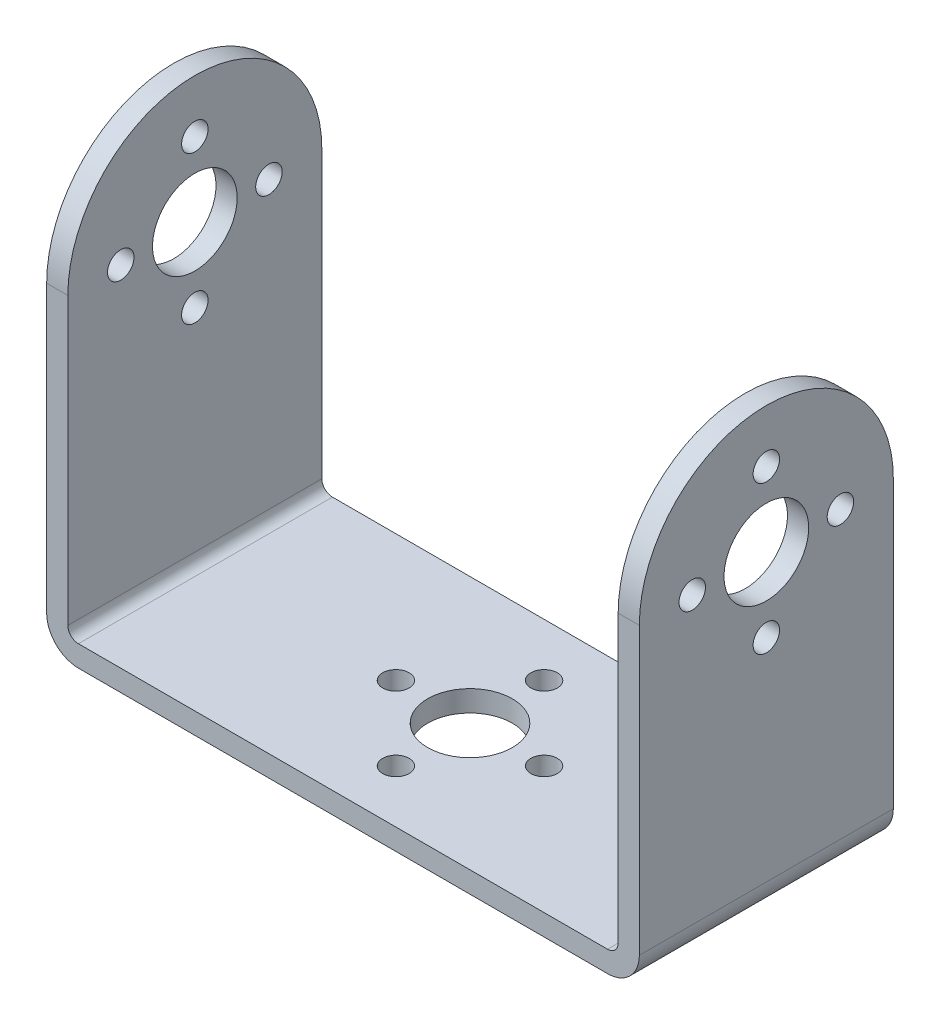
ISO-10303-21;
HEADER;
FILE_DESCRIPTION(('STEP AP214'),'2;1');
FILE_NAME('part.step','',(''),(''),'','','');
FILE_SCHEMA(('AUTOMOTIVE_DESIGN { 1 0 10303 214 1 1 1 1 }'));
ENDSEC;
DATA;
#1=APPLICATION_CONTEXT('core data for automotive mechanical design processes');
#2=APPLICATION_PROTOCOL_DEFINITION('international standard','automotive_design',2000,#1);
#3=PRODUCT_CONTEXT('',#1,'mechanical');
#4=PRODUCT('Part','Part','',(#3));
#5=PRODUCT_RELATED_PRODUCT_CATEGORY('part','',(#4));
#6=PRODUCT_DEFINITION_FORMATION('','',#4);
#7=PRODUCT_DEFINITION_CONTEXT('part definition',#1,'design');
#8=PRODUCT_DEFINITION('design','',#6,#7);
#9=PRODUCT_DEFINITION_SHAPE('','',#8);
#10=(LENGTH_UNIT() NAMED_UNIT(*) SI_UNIT(.MILLI.,.METRE.));
#11=(NAMED_UNIT(*) PLANE_ANGLE_UNIT() SI_UNIT($,.RADIAN.));
#12=(NAMED_UNIT(*) SI_UNIT($,.STERADIAN.) SOLID_ANGLE_UNIT());
#13=UNCERTAINTY_MEASURE_WITH_UNIT(LENGTH_MEASURE(1.E-05),#10,'distance_accuracy_value','');
#14=(GEOMETRIC_REPRESENTATION_CONTEXT(3) GLOBAL_UNCERTAINTY_ASSIGNED_CONTEXT((#13)) GLOBAL_UNIT_ASSIGNED_CONTEXT((#10,
#11,#12)) REPRESENTATION_CONTEXT('',''));
#15=CARTESIAN_POINT('',(0.,0.,0.));
#16=DIRECTION('',(0.,0.,1.));
#17=DIRECTION('',(1.,0.,0.));
#18=AXIS2_PLACEMENT_3D('',#15,#16,#17);
#19=CARTESIAN_POINT('',(-26.,42.,12.));
#20=DIRECTION('',(1.,0.,0.));
#21=DIRECTION('',(0.,1.,0.));
#22=AXIS2_PLACEMENT_3D('',#19,#20,#21);
#23=PLANE('',#22);
#24=DIRECTION('',(0.,1.,0.));
#25=VECTOR('',#24,1.);
#26=CARTESIAN_POINT('',(-26.,2.,12.));
#27=LINE('',#26,#25);
#28=CARTESIAN_POINT('',(-26.,3.00000000000001,12.));
#29=VERTEX_POINT('',#28);
#30=CARTESIAN_POINT('',(-26.,30.,12.));
#31=VERTEX_POINT('',#30);
#32=EDGE_CURVE('E106',#29,#31,#27,.T.);
#33=ORIENTED_EDGE('',*,*,#32,.F.);
#34=DIRECTION('',(0.,0.,-1.));
#35=VECTOR('',#34,1.);
#36=CARTESIAN_POINT('',(-26.,3.00000000000001,12.));
#37=LINE('',#36,#35);
#38=CARTESIAN_POINT('',(-26.,3.00000000000002,-12.));
#39=VERTEX_POINT('',#38);
#40=EDGE_CURVE('E610',#29,#39,#37,.T.);
#41=ORIENTED_EDGE('',*,*,#40,.T.);
#42=DIRECTION('',(0.,1.,0.));
#43=VECTOR('',#42,1.);
#44=CARTESIAN_POINT('',(-26.,3.,-12.));
#45=LINE('',#44,#43);
#46=CARTESIAN_POINT('',(-26.,30.,-12.));
#47=VERTEX_POINT('',#46);
#48=EDGE_CURVE('E108',#39,#47,#45,.T.);
#49=ORIENTED_EDGE('',*,*,#48,.T.);
#50=CARTESIAN_POINT('',(-26.,30.,0.));
#51=DIRECTION('',(1.,0.,0.));
#52=DIRECTION('',(0.,1.,0.));
#53=AXIS2_PLACEMENT_3D('',#50,#51,#52);
#54=CIRCLE('',#53,12.);
#55=EDGE_CURVE('E102',#31,#47,#54,.F.);
#56=ORIENTED_EDGE('',*,*,#55,.F.);
#57=EDGE_LOOP('',(#33,#41,#49,#56));
#58=FACE_BOUND('',#57,.T.);
#59=CARTESIAN_POINT('',(-26.,30.,0.));
#60=DIRECTION('',(1.,0.,0.));
#61=DIRECTION('',(0.,0.,-1.));
#62=AXIS2_PLACEMENT_3D('',#59,#60,#61);
#63=CIRCLE('',#62,4.);
#64=CARTESIAN_POINT('',(-26.,30.,-4.));
#65=VERTEX_POINT('',#64);
#66=EDGE_CURVE('E114',#65,#65,#63,.F.);
#67=ORIENTED_EDGE('',*,*,#66,.T.);
#68=EDGE_LOOP('',(#67));
#69=FACE_BOUND('',#68,.T.);
#70=CARTESIAN_POINT('',(-26.,30.,7.));
#71=DIRECTION('',(1.,0.,0.));
#72=DIRECTION('',(0.,0.,-1.));
#73=AXIS2_PLACEMENT_3D('',#70,#71,#72);
#74=CIRCLE('',#73,1.25);
#75=CARTESIAN_POINT('',(-26.,30.,5.75));
#76=VERTEX_POINT('',#75);
#77=EDGE_CURVE('E244',#76,#76,#74,.F.);
#78=ORIENTED_EDGE('',*,*,#77,.T.);
#79=EDGE_LOOP('',(#78));
#80=FACE_BOUND('',#79,.T.);
#81=CARTESIAN_POINT('',(-26.,23.,0.));
#82=DIRECTION('',(1.,0.,0.));
#83=DIRECTION('',(0.,0.,-1.));
#84=AXIS2_PLACEMENT_3D('',#81,#82,#83);
#85=CIRCLE('',#84,1.25);
#86=CARTESIAN_POINT('',(-26.,23.,-1.25));
#87=VERTEX_POINT('',#86);
#88=EDGE_CURVE('E247',#87,#87,#85,.F.);
#89=ORIENTED_EDGE('',*,*,#88,.T.);
#90=EDGE_LOOP('',(#89));
#91=FACE_BOUND('',#90,.T.);
#92=CARTESIAN_POINT('',(-26.,30.,-7.));
#93=DIRECTION('',(1.,0.,0.));
#94=DIRECTION('',(0.,0.,-1.));
#95=AXIS2_PLACEMENT_3D('',#92,#93,#94);
#96=CIRCLE('',#95,1.25);
#97=CARTESIAN_POINT('',(-26.,30.,-8.25));
#98=VERTEX_POINT('',#97);
#99=EDGE_CURVE('E249',#98,#98,#96,.F.);
#100=ORIENTED_EDGE('',*,*,#99,.T.);
#101=EDGE_LOOP('',(#100));
#102=FACE_BOUND('',#101,.T.);
#103=CARTESIAN_POINT('',(-26.,37.,0.));
#104=DIRECTION('',(1.,0.,0.));
#105=DIRECTION('',(0.,0.,-1.));
#106=AXIS2_PLACEMENT_3D('',#103,#104,#105);
#107=CIRCLE('',#106,1.25);
#108=CARTESIAN_POINT('',(-26.,37.,-1.25));
#109=VERTEX_POINT('',#108);
#110=EDGE_CURVE('E20',#109,#109,#107,.F.);
#111=ORIENTED_EDGE('',*,*,#110,.T.);
#112=EDGE_LOOP('',(#111));
#113=FACE_BOUND('',#112,.T.);
#114=ADVANCED_FACE('F17',(#58,#69,#80,#91,#102,#113),#23,.T.);
#115=CARTESIAN_POINT('',(26.,0.,12.));
#116=DIRECTION('',(-1.,0.,0.));
#117=DIRECTION('',(0.,-1.,0.));
#118=AXIS2_PLACEMENT_3D('',#115,#116,#117);
#119=PLANE('',#118);
#120=DIRECTION('',(0.,0.,-1.));
#121=VECTOR('',#120,1.);
#122=CARTESIAN_POINT('',(26.,3.,12.));
#123=LINE('',#122,#121);
#124=CARTESIAN_POINT('',(26.,3.,-12.));
#125=VERTEX_POINT('',#124);
#126=CARTESIAN_POINT('',(26.,3.,12.));
#127=VERTEX_POINT('',#126);
#128=EDGE_CURVE('E224',#125,#127,#123,.F.);
#129=ORIENTED_EDGE('',*,*,#128,.T.);
#130=DIRECTION('',(0.,1.,0.));
#131=VECTOR('',#130,1.);
#132=CARTESIAN_POINT('',(26.,3.,12.));
#133=LINE('',#132,#131);
#134=CARTESIAN_POINT('',(26.,30.,12.));
#135=VERTEX_POINT('',#134);
#136=EDGE_CURVE('E604',#135,#127,#133,.F.);
#137=ORIENTED_EDGE('',*,*,#136,.F.);
#138=CARTESIAN_POINT('',(26.,30.,0.));
#139=DIRECTION('',(-1.,0.,0.));
#140=DIRECTION('',(0.,-1.,0.));
#141=AXIS2_PLACEMENT_3D('',#138,#139,#140);
#142=CIRCLE('',#141,12.);
#143=CARTESIAN_POINT('',(26.,30.,-12.));
#144=VERTEX_POINT('',#143);
#145=EDGE_CURVE('E225',#144,#135,#142,.F.);
#146=ORIENTED_EDGE('',*,*,#145,.F.);
#147=DIRECTION('',(0.,1.,0.));
#148=VECTOR('',#147,1.);
#149=CARTESIAN_POINT('',(26.,2.,-12.));
#150=LINE('',#149,#148);
#151=EDGE_CURVE('E219',#125,#144,#150,.T.);
#152=ORIENTED_EDGE('',*,*,#151,.F.);
#153=EDGE_LOOP('',(#129,#137,#146,#152));
#154=FACE_BOUND('',#153,.T.);
#155=CARTESIAN_POINT('',(26.,30.,0.));
#156=DIRECTION('',(1.,0.,0.));
#157=DIRECTION('',(0.,0.,-1.));
#158=AXIS2_PLACEMENT_3D('',#155,#156,#157);
#159=CIRCLE('',#158,4.);
#160=CARTESIAN_POINT('',(26.,30.,-4.));
#161=VERTEX_POINT('',#160);
#162=EDGE_CURVE('E228',#161,#161,#159,.T.);
#163=ORIENTED_EDGE('',*,*,#162,.T.);
#164=EDGE_LOOP('',(#163));
#165=FACE_BOUND('',#164,.T.);
#166=CARTESIAN_POINT('',(26.,30.,7.));
#167=DIRECTION('',(1.,0.,0.));
#168=DIRECTION('',(0.,0.,-1.));
#169=AXIS2_PLACEMENT_3D('',#166,#167,#168);
#170=CIRCLE('',#169,1.25);
#171=CARTESIAN_POINT('',(26.,30.,5.75));
#172=VERTEX_POINT('',#171);
#173=EDGE_CURVE('E231',#172,#172,#170,.T.);
#174=ORIENTED_EDGE('',*,*,#173,.T.);
#175=EDGE_LOOP('',(#174));
#176=FACE_BOUND('',#175,.T.);
#177=CARTESIAN_POINT('',(26.,23.,0.));
#178=DIRECTION('',(1.,0.,0.));
#179=DIRECTION('',(0.,0.,-1.));
#180=AXIS2_PLACEMENT_3D('',#177,#178,#179);
#181=CIRCLE('',#180,1.25);
#182=CARTESIAN_POINT('',(26.,23.,-1.25));
#183=VERTEX_POINT('',#182);
#184=EDGE_CURVE('E234',#183,#183,#181,.T.);
#185=ORIENTED_EDGE('',*,*,#184,.T.);
#186=EDGE_LOOP('',(#185));
#187=FACE_BOUND('',#186,.T.);
#188=CARTESIAN_POINT('',(26.,30.,-7.));
#189=DIRECTION('',(1.,0.,0.));
#190=DIRECTION('',(0.,0.,-1.));
#191=AXIS2_PLACEMENT_3D('',#188,#189,#190);
#192=CIRCLE('',#191,1.25);
#193=CARTESIAN_POINT('',(26.,30.,-8.25));
#194=VERTEX_POINT('',#193);
#195=EDGE_CURVE('E237',#194,#194,#192,.T.);
#196=ORIENTED_EDGE('',*,*,#195,.T.);
#197=EDGE_LOOP('',(#196));
#198=FACE_BOUND('',#197,.T.);
#199=CARTESIAN_POINT('',(26.,37.,0.));
#200=DIRECTION('',(1.,0.,0.));
#201=DIRECTION('',(0.,0.,-1.));
#202=AXIS2_PLACEMENT_3D('',#199,#200,#201);
#203=CIRCLE('',#202,1.25);
#204=CARTESIAN_POINT('',(26.,37.,-1.25));
#205=VERTEX_POINT('',#204);
#206=EDGE_CURVE('E123',#205,#205,#203,.T.);
#207=ORIENTED_EDGE('',*,*,#206,.T.);
#208=EDGE_LOOP('',(#207));
#209=FACE_BOUND('',#208,.T.);
#210=ADVANCED_FACE('F260',(#154,#165,#176,#187,#198,#209),#119,.T.);
#211=CARTESIAN_POINT('',(28.,37.,0.));
#212=DIRECTION('',(1.,0.,0.));
#213=DIRECTION('',(0.,0.,-1.));
#214=AXIS2_PLACEMENT_3D('',#211,#212,#213);
#215=CYLINDRICAL_SURFACE('',#214,1.25);
#216=CARTESIAN_POINT('',(-28.,37.,0.));
#217=DIRECTION('',(1.,0.,0.));
#218=DIRECTION('',(0.,0.,-1.));
#219=AXIS2_PLACEMENT_3D('',#216,#217,#218);
#220=CIRCLE('',#219,1.25);
#221=CARTESIAN_POINT('',(-28.,37.,-1.25));
#222=VERTEX_POINT('',#221);
#223=EDGE_CURVE('E216',#222,#222,#220,.F.);
#224=ORIENTED_EDGE('',*,*,#223,.T.);
#225=EDGE_LOOP('',(#224));
#226=FACE_BOUND('',#225,.T.);
#227=ORIENTED_EDGE('',*,*,#110,.F.);
#228=EDGE_LOOP('',(#227));
#229=FACE_BOUND('',#228,.T.);
#230=ADVANCED_FACE('F257',(#226,#229),#215,.F.);
#231=CARTESIAN_POINT('',(28.,30.,-7.));
#232=DIRECTION('',(1.,0.,0.));
#233=DIRECTION('',(0.,0.,-1.));
#234=AXIS2_PLACEMENT_3D('',#231,#232,#233);
#235=CYLINDRICAL_SURFACE('',#234,1.25);
#236=CARTESIAN_POINT('',(-28.,30.,-7.));
#237=DIRECTION('',(1.,0.,0.));
#238=DIRECTION('',(0.,0.,-1.));
#239=AXIS2_PLACEMENT_3D('',#236,#237,#238);
#240=CIRCLE('',#239,1.25);
#241=CARTESIAN_POINT('',(-28.,30.,-8.25));
#242=VERTEX_POINT('',#241);
#243=EDGE_CURVE('E213',#242,#242,#240,.F.);
#244=ORIENTED_EDGE('',*,*,#243,.T.);
#245=EDGE_LOOP('',(#244));
#246=FACE_BOUND('',#245,.T.);
#247=ORIENTED_EDGE('',*,*,#99,.F.);
#248=EDGE_LOOP('',(#247));
#249=FACE_BOUND('',#248,.T.);
#250=ADVANCED_FACE('F259',(#246,#249),#235,.F.);
#251=CARTESIAN_POINT('',(28.,23.,0.));
#252=DIRECTION('',(1.,0.,0.));
#253=DIRECTION('',(0.,0.,-1.));
#254=AXIS2_PLACEMENT_3D('',#251,#252,#253);
#255=CYLINDRICAL_SURFACE('',#254,1.25);
#256=CARTESIAN_POINT('',(-28.,23.,0.));
#257=DIRECTION('',(1.,0.,0.));
#258=DIRECTION('',(0.,0.,-1.));
#259=AXIS2_PLACEMENT_3D('',#256,#257,#258);
#260=CIRCLE('',#259,1.25);
#261=CARTESIAN_POINT('',(-28.,23.,-1.25));
#262=VERTEX_POINT('',#261);
#263=EDGE_CURVE('E210',#262,#262,#260,.F.);
#264=ORIENTED_EDGE('',*,*,#263,.T.);
#265=EDGE_LOOP('',(#264));
#266=FACE_BOUND('',#265,.T.);
#267=ORIENTED_EDGE('',*,*,#88,.F.);
#268=EDGE_LOOP('',(#267));
#269=FACE_BOUND('',#268,.T.);
#270=ADVANCED_FACE('F268',(#266,#269),#255,.F.);
#271=CARTESIAN_POINT('',(28.,30.,7.));
#272=DIRECTION('',(1.,0.,0.));
#273=DIRECTION('',(0.,0.,-1.));
#274=AXIS2_PLACEMENT_3D('',#271,#272,#273);
#275=CYLINDRICAL_SURFACE('',#274,1.25);
#276=CARTESIAN_POINT('',(-28.,30.,7.));
#277=DIRECTION('',(1.,0.,0.));
#278=DIRECTION('',(0.,0.,-1.));
#279=AXIS2_PLACEMENT_3D('',#276,#277,#278);
#280=CIRCLE('',#279,1.25);
#281=CARTESIAN_POINT('',(-28.,30.,5.75));
#282=VERTEX_POINT('',#281);
#283=EDGE_CURVE('E207',#282,#282,#280,.F.);
#284=ORIENTED_EDGE('',*,*,#283,.T.);
#285=EDGE_LOOP('',(#284));
#286=FACE_BOUND('',#285,.T.);
#287=ORIENTED_EDGE('',*,*,#77,.F.);
#288=EDGE_LOOP('',(#287));
#289=FACE_BOUND('',#288,.T.);
#290=ADVANCED_FACE('F363',(#286,#289),#275,.F.);
#291=CARTESIAN_POINT('',(28.,30.,0.));
#292=DIRECTION('',(1.,0.,0.));
#293=DIRECTION('',(0.,0.,-1.));
#294=AXIS2_PLACEMENT_3D('',#291,#292,#293);
#295=CYLINDRICAL_SURFACE('',#294,4.);
#296=CARTESIAN_POINT('',(-28.,30.,0.));
#297=DIRECTION('',(1.,0.,0.));
#298=DIRECTION('',(0.,0.,-1.));
#299=AXIS2_PLACEMENT_3D('',#296,#297,#298);
#300=CIRCLE('',#299,4.);
#301=CARTESIAN_POINT('',(-28.,30.,-4.));
#302=VERTEX_POINT('',#301);
#303=EDGE_CURVE('E203',#302,#302,#300,.F.);
#304=ORIENTED_EDGE('',*,*,#303,.T.);
#305=EDGE_LOOP('',(#304));
#306=FACE_BOUND('',#305,.T.);
#307=ORIENTED_EDGE('',*,*,#66,.F.);
#308=EDGE_LOOP('',(#307));
#309=FACE_BOUND('',#308,.T.);
#310=ADVANCED_FACE('F360',(#306,#309),#295,.F.);
#311=CARTESIAN_POINT('',(-26.,30.,0.));
#312=DIRECTION('',(1.,0.,0.));
#313=DIRECTION('',(0.,1.,0.));
#314=AXIS2_PLACEMENT_3D('',#311,#312,#313);
#315=CYLINDRICAL_SURFACE('',#314,12.);
#316=DIRECTION('',(1.,0.,0.));
#317=VECTOR('',#316,1.);
#318=CARTESIAN_POINT('',(-25.,30.,12.));
#319=LINE('',#318,#317);
#320=CARTESIAN_POINT('',(-28.,30.,12.));
#321=VERTEX_POINT('',#320);
#322=EDGE_CURVE('E113',#31,#321,#319,.F.);
#323=ORIENTED_EDGE('',*,*,#322,.F.);
#324=ORIENTED_EDGE('',*,*,#55,.T.);
#325=DIRECTION('',(1.,0.,0.));
#326=VECTOR('',#325,1.);
#327=CARTESIAN_POINT('',(25.,30.,-12.));
#328=LINE('',#327,#326);
#329=CARTESIAN_POINT('',(-28.,30.,-12.));
#330=VERTEX_POINT('',#329);
#331=EDGE_CURVE('E131',#47,#330,#328,.F.);
#332=ORIENTED_EDGE('',*,*,#331,.T.);
#333=CARTESIAN_POINT('',(-28.,30.,0.));
#334=DIRECTION('',(1.,0.,0.));
#335=DIRECTION('',(0.,1.,0.));
#336=AXIS2_PLACEMENT_3D('',#333,#334,#335);
#337=CIRCLE('',#336,12.);
#338=EDGE_CURVE('E127',#330,#321,#337,.T.);
#339=ORIENTED_EDGE('',*,*,#338,.T.);
#340=EDGE_LOOP('',(#323,#324,#332,#339));
#341=FACE_BOUND('',#340,.T.);
#342=ADVANCED_FACE('F126',(#341),#315,.T.);
#343=CARTESIAN_POINT('',(28.,37.,0.));
#344=DIRECTION('',(1.,0.,0.));
#345=DIRECTION('',(0.,0.,-1.));
#346=AXIS2_PLACEMENT_3D('',#343,#344,#345);
#347=CYLINDRICAL_SURFACE('',#346,1.25);
#348=ORIENTED_EDGE('',*,*,#206,.F.);
#349=EDGE_LOOP('',(#348));
#350=FACE_BOUND('',#349,.T.);
#351=CARTESIAN_POINT('',(28.,37.,0.));
#352=DIRECTION('',(1.,0.,0.));
#353=DIRECTION('',(0.,0.,-1.));
#354=AXIS2_PLACEMENT_3D('',#351,#352,#353);
#355=CIRCLE('',#354,1.25);
#356=CARTESIAN_POINT('',(28.,37.,-1.25));
#357=VERTEX_POINT('',#356);
#358=EDGE_CURVE('E197',#357,#357,#355,.T.);
#359=ORIENTED_EDGE('',*,*,#358,.T.);
#360=EDGE_LOOP('',(#359));
#361=FACE_BOUND('',#360,.T.);
#362=ADVANCED_FACE('F353',(#350,#361),#347,.F.);
#363=CARTESIAN_POINT('',(28.,30.,-7.));
#364=DIRECTION('',(1.,0.,0.));
#365=DIRECTION('',(0.,0.,-1.));
#366=AXIS2_PLACEMENT_3D('',#363,#364,#365);
#367=CYLINDRICAL_SURFACE('',#366,1.25);
#368=ORIENTED_EDGE('',*,*,#195,.F.);
#369=EDGE_LOOP('',(#368));
#370=FACE_BOUND('',#369,.T.);
#371=CARTESIAN_POINT('',(28.,30.,-7.));
#372=DIRECTION('',(1.,0.,0.));
#373=DIRECTION('',(0.,0.,-1.));
#374=AXIS2_PLACEMENT_3D('',#371,#372,#373);
#375=CIRCLE('',#374,1.25);
#376=CARTESIAN_POINT('',(28.,30.,-8.25));
#377=VERTEX_POINT('',#376);
#378=EDGE_CURVE('E194',#377,#377,#375,.T.);
#379=ORIENTED_EDGE('',*,*,#378,.T.);
#380=EDGE_LOOP('',(#379));
#381=FACE_BOUND('',#380,.T.);
#382=ADVANCED_FACE('F349',(#370,#381),#367,.F.);
#383=CARTESIAN_POINT('',(28.,23.,0.));
#384=DIRECTION('',(1.,0.,0.));
#385=DIRECTION('',(0.,0.,-1.));
#386=AXIS2_PLACEMENT_3D('',#383,#384,#385);
#387=CYLINDRICAL_SURFACE('',#386,1.25);
#388=ORIENTED_EDGE('',*,*,#184,.F.);
#389=EDGE_LOOP('',(#388));
#390=FACE_BOUND('',#389,.T.);
#391=CARTESIAN_POINT('',(28.,23.,0.));
#392=DIRECTION('',(1.,0.,0.));
#393=DIRECTION('',(0.,0.,-1.));
#394=AXIS2_PLACEMENT_3D('',#391,#392,#393);
#395=CIRCLE('',#394,1.25);
#396=CARTESIAN_POINT('',(28.,23.,-1.25));
#397=VERTEX_POINT('',#396);
#398=EDGE_CURVE('E191',#397,#397,#395,.T.);
#399=ORIENTED_EDGE('',*,*,#398,.T.);
#400=EDGE_LOOP('',(#399));
#401=FACE_BOUND('',#400,.T.);
#402=ADVANCED_FACE('F345',(#390,#401),#387,.F.);
#403=CARTESIAN_POINT('',(28.,30.,7.));
#404=DIRECTION('',(1.,0.,0.));
#405=DIRECTION('',(0.,0.,-1.));
#406=AXIS2_PLACEMENT_3D('',#403,#404,#405);
#407=CYLINDRICAL_SURFACE('',#406,1.25);
#408=ORIENTED_EDGE('',*,*,#173,.F.);
#409=EDGE_LOOP('',(#408));
#410=FACE_BOUND('',#409,.T.);
#411=CARTESIAN_POINT('',(28.,30.,7.));
#412=DIRECTION('',(1.,0.,0.));
#413=DIRECTION('',(0.,0.,-1.));
#414=AXIS2_PLACEMENT_3D('',#411,#412,#413);
#415=CIRCLE('',#414,1.25);
#416=CARTESIAN_POINT('',(28.,30.,5.75));
#417=VERTEX_POINT('',#416);
#418=EDGE_CURVE('E188',#417,#417,#415,.T.);
#419=ORIENTED_EDGE('',*,*,#418,.T.);
#420=EDGE_LOOP('',(#419));
#421=FACE_BOUND('',#420,.T.);
#422=ADVANCED_FACE('F341',(#410,#421),#407,.F.);
#423=CARTESIAN_POINT('',(28.,30.,0.));
#424=DIRECTION('',(1.,0.,0.));
#425=DIRECTION('',(0.,0.,-1.));
#426=AXIS2_PLACEMENT_3D('',#423,#424,#425);
#427=CYLINDRICAL_SURFACE('',#426,4.);
#428=ORIENTED_EDGE('',*,*,#162,.F.);
#429=EDGE_LOOP('',(#428));
#430=FACE_BOUND('',#429,.T.);
#431=CARTESIAN_POINT('',(28.,30.,0.));
#432=DIRECTION('',(1.,0.,0.));
#433=DIRECTION('',(0.,0.,-1.));
#434=AXIS2_PLACEMENT_3D('',#431,#432,#433);
#435=CIRCLE('',#434,4.);
#436=CARTESIAN_POINT('',(28.,30.,-4.));
#437=VERTEX_POINT('',#436);
#438=EDGE_CURVE('E185',#437,#437,#435,.T.);
#439=ORIENTED_EDGE('',*,*,#438,.T.);
#440=EDGE_LOOP('',(#439));
#441=FACE_BOUND('',#440,.T.);
#442=ADVANCED_FACE('F337',(#430,#441),#427,.F.);
#443=CARTESIAN_POINT('',(28.,30.,0.));
#444=DIRECTION('',(-1.,0.,0.));
#445=DIRECTION('',(0.,-1.,0.));
#446=AXIS2_PLACEMENT_3D('',#443,#444,#445);
#447=CYLINDRICAL_SURFACE('',#446,12.);
#448=DIRECTION('',(-1.,0.,0.));
#449=VECTOR('',#448,1.);
#450=CARTESIAN_POINT('',(25.,30.,-12.));
#451=LINE('',#450,#449);
#452=CARTESIAN_POINT('',(28.,30.,-12.));
#453=VERTEX_POINT('',#452);
#454=EDGE_CURVE('E223',#144,#453,#451,.F.);
#455=ORIENTED_EDGE('',*,*,#454,.F.);
#456=ORIENTED_EDGE('',*,*,#145,.T.);
#457=DIRECTION('',(1.,0.,0.));
#458=VECTOR('',#457,1.);
#459=CARTESIAN_POINT('',(25.,30.,12.));
#460=LINE('',#459,#458);
#461=CARTESIAN_POINT('',(28.,30.,12.));
#462=VERTEX_POINT('',#461);
#463=EDGE_CURVE('E227',#462,#135,#460,.F.);
#464=ORIENTED_EDGE('',*,*,#463,.F.);
#465=CARTESIAN_POINT('',(28.,30.,0.));
#466=DIRECTION('',(-1.,0.,0.));
#467=DIRECTION('',(0.,-1.,0.));
#468=AXIS2_PLACEMENT_3D('',#465,#466,#467);
#469=CIRCLE('',#468,12.);
#470=EDGE_CURVE('E181',#462,#453,#469,.T.);
#471=ORIENTED_EDGE('',*,*,#470,.T.);
#472=EDGE_LOOP('',(#455,#456,#464,#471));
#473=FACE_BOUND('',#472,.T.);
#474=ADVANCED_FACE('F333',(#473),#447,.T.);
#475=CARTESIAN_POINT('',(-25.,3.00000000000001,12.));
#476=DIRECTION('',(0.,0.,-1.));
#477=DIRECTION('',(-1.,0.,0.));
#478=AXIS2_PLACEMENT_3D('',#475,#476,#477);
#479=CYLINDRICAL_SURFACE('',#478,1.);
#480=ORIENTED_EDGE('',*,*,#40,.F.);
#481=CARTESIAN_POINT('',(-25.,3.00000000000001,12.));
#482=DIRECTION('',(0.,0.,-1.));
#483=DIRECTION('',(-1.,0.,0.));
#484=AXIS2_PLACEMENT_3D('',#481,#482,#483);
#485=CIRCLE('',#484,1.);
#486=CARTESIAN_POINT('',(-25.,2.,12.));
#487=VERTEX_POINT('',#486);
#488=EDGE_CURVE('E122',#487,#29,#485,.T.);
#489=ORIENTED_EDGE('',*,*,#488,.F.);
#490=DIRECTION('',(0.,0.,1.));
#491=VECTOR('',#490,1.);
#492=CARTESIAN_POINT('',(-25.,2.,12.));
#493=LINE('',#492,#491);
#494=CARTESIAN_POINT('',(-25.,2.,-12.));
#495=VERTEX_POINT('',#494);
#496=EDGE_CURVE('E177',#495,#487,#493,.T.);
#497=ORIENTED_EDGE('',*,*,#496,.F.);
#498=CARTESIAN_POINT('',(-25.,3.00000000000001,-12.));
#499=DIRECTION('',(0.,0.,-1.));
#500=DIRECTION('',(-1.,0.,0.));
#501=AXIS2_PLACEMENT_3D('',#498,#499,#500);
#502=CIRCLE('',#501,1.);
#503=EDGE_CURVE('E175',#39,#495,#502,.F.);
#504=ORIENTED_EDGE('',*,*,#503,.F.);
#505=EDGE_LOOP('',(#480,#489,#497,#504));
#506=FACE_BOUND('',#505,.T.);
#507=ADVANCED_FACE('F329',(#506),#479,.F.);
#508=CARTESIAN_POINT('',(25.,3.,12.));
#509=DIRECTION('',(0.,0.,-1.));
#510=DIRECTION('',(-1.,0.,0.));
#511=AXIS2_PLACEMENT_3D('',#508,#509,#510);
#512=CYLINDRICAL_SURFACE('',#511,1.);
#513=DIRECTION('',(0.,0.,1.));
#514=VECTOR('',#513,1.);
#515=CARTESIAN_POINT('',(25.,2.,12.));
#516=LINE('',#515,#514);
#517=CARTESIAN_POINT('',(25.,2.,12.));
#518=VERTEX_POINT('',#517);
#519=CARTESIAN_POINT('',(25.,2.,-12.));
#520=VERTEX_POINT('',#519);
#521=EDGE_CURVE('E174',#518,#520,#516,.F.);
#522=ORIENTED_EDGE('',*,*,#521,.F.);
#523=CARTESIAN_POINT('',(25.,3.,12.));
#524=DIRECTION('',(0.,0.,-1.));
#525=DIRECTION('',(-1.,0.,0.));
#526=AXIS2_PLACEMENT_3D('',#523,#524,#525);
#527=CIRCLE('',#526,1.);
#528=EDGE_CURVE('E178',#127,#518,#527,.T.);
#529=ORIENTED_EDGE('',*,*,#528,.F.);
#530=ORIENTED_EDGE('',*,*,#128,.F.);
#531=CARTESIAN_POINT('',(25.,3.,-12.));
#532=DIRECTION('',(0.,0.,-1.));
#533=DIRECTION('',(-1.,0.,0.));
#534=AXIS2_PLACEMENT_3D('',#531,#532,#533);
#535=CIRCLE('',#534,1.);
#536=EDGE_CURVE('E220',#520,#125,#535,.F.);
#537=ORIENTED_EDGE('',*,*,#536,.F.);
#538=EDGE_LOOP('',(#522,#529,#530,#537));
#539=FACE_BOUND('',#538,.T.);
#540=ADVANCED_FACE('F325',(#539),#512,.F.);
#541=CARTESIAN_POINT('',(-28.,42.,12.));
#542=DIRECTION('',(1.,0.,0.));
#543=DIRECTION('',(0.,1.,0.));
#544=AXIS2_PLACEMENT_3D('',#541,#542,#543);
#545=PLANE('',#544);
#546=ORIENTED_EDGE('',*,*,#338,.F.);
#547=DIRECTION('',(0.,1.,0.));
#548=VECTOR('',#547,1.);
#549=CARTESIAN_POINT('',(-28.,42.,-12.));
#550=LINE('',#549,#548);
#551=CARTESIAN_POINT('',(-28.,3.00000000000002,-12.));
#552=VERTEX_POINT('',#551);
#553=EDGE_CURVE('E202',#552,#330,#550,.T.);
#554=ORIENTED_EDGE('',*,*,#553,.F.);
#555=DIRECTION('',(0.,0.,-1.));
#556=VECTOR('',#555,1.);
#557=CARTESIAN_POINT('',(-28.,3.00000000000001,12.));
#558=LINE('',#557,#556);
#559=CARTESIAN_POINT('',(-28.,3.00000000000001,12.));
#560=VERTEX_POINT('',#559);
#561=EDGE_CURVE('E156',#560,#552,#558,.T.);
#562=ORIENTED_EDGE('',*,*,#561,.F.);
#563=DIRECTION('',(0.,1.,0.));
#564=VECTOR('',#563,1.);
#565=CARTESIAN_POINT('',(-28.,42.,12.));
#566=LINE('',#565,#564);
#567=EDGE_CURVE('E206',#321,#560,#566,.F.);
#568=ORIENTED_EDGE('',*,*,#567,.F.);
#569=EDGE_LOOP('',(#546,#554,#562,#568));
#570=FACE_BOUND('',#569,.T.);
#571=ORIENTED_EDGE('',*,*,#303,.F.);
#572=EDGE_LOOP('',(#571));
#573=FACE_BOUND('',#572,.T.);
#574=ORIENTED_EDGE('',*,*,#283,.F.);
#575=EDGE_LOOP('',(#574));
#576=FACE_BOUND('',#575,.T.);
#577=ORIENTED_EDGE('',*,*,#263,.F.);
#578=EDGE_LOOP('',(#577));
#579=FACE_BOUND('',#578,.T.);
#580=ORIENTED_EDGE('',*,*,#243,.F.);
#581=EDGE_LOOP('',(#580));
#582=FACE_BOUND('',#581,.T.);
#583=ORIENTED_EDGE('',*,*,#223,.F.);
#584=EDGE_LOOP('',(#583));
#585=FACE_BOUND('',#584,.T.);
#586=ADVANCED_FACE('F321',(#570,#573,#576,#579,#582,#585),#545,.F.);
#587=CARTESIAN_POINT('',(28.,0.,12.));
#588=DIRECTION('',(-1.,0.,0.));
#589=DIRECTION('',(0.,-1.,0.));
#590=AXIS2_PLACEMENT_3D('',#587,#588,#589);
#591=PLANE('',#590);
#592=ORIENTED_EDGE('',*,*,#470,.F.);
#593=DIRECTION('',(0.,-1.,0.));
#594=VECTOR('',#593,1.);
#595=CARTESIAN_POINT('',(28.,0.,12.));
#596=LINE('',#595,#594);
#597=CARTESIAN_POINT('',(28.,3.,12.));
#598=VERTEX_POINT('',#597);
#599=EDGE_CURVE('E184',#598,#462,#596,.F.);
#600=ORIENTED_EDGE('',*,*,#599,.F.);
#601=DIRECTION('',(0.,0.,-1.));
#602=VECTOR('',#601,1.);
#603=CARTESIAN_POINT('',(28.,3.,12.));
#604=LINE('',#603,#602);
#605=CARTESIAN_POINT('',(28.,3.,-12.));
#606=VERTEX_POINT('',#605);
#607=EDGE_CURVE('E151',#606,#598,#604,.F.);
#608=ORIENTED_EDGE('',*,*,#607,.F.);
#609=DIRECTION('',(0.,-1.,0.));
#610=VECTOR('',#609,1.);
#611=CARTESIAN_POINT('',(28.,0.,-12.));
#612=LINE('',#611,#610);
#613=EDGE_CURVE('E180',#453,#606,#612,.T.);
#614=ORIENTED_EDGE('',*,*,#613,.F.);
#615=EDGE_LOOP('',(#592,#600,#608,#614));
#616=FACE_BOUND('',#615,.T.);
#617=ORIENTED_EDGE('',*,*,#438,.F.);
#618=EDGE_LOOP('',(#617));
#619=FACE_BOUND('',#618,.T.);
#620=ORIENTED_EDGE('',*,*,#418,.F.);
#621=EDGE_LOOP('',(#620));
#622=FACE_BOUND('',#621,.T.);
#623=ORIENTED_EDGE('',*,*,#398,.F.);
#624=EDGE_LOOP('',(#623));
#625=FACE_BOUND('',#624,.T.);
#626=ORIENTED_EDGE('',*,*,#378,.F.);
#627=EDGE_LOOP('',(#626));
#628=FACE_BOUND('',#627,.T.);
#629=ORIENTED_EDGE('',*,*,#358,.F.);
#630=EDGE_LOOP('',(#629));
#631=FACE_BOUND('',#630,.T.);
#632=ADVANCED_FACE('F317',(#616,#619,#622,#625,#628,#631),#591,.F.);
#633=CARTESIAN_POINT('',(-28.,2.,12.));
#634=DIRECTION('',(0.,1.,0.));
#635=DIRECTION('',(0.,0.,1.));
#636=AXIS2_PLACEMENT_3D('',#633,#634,#635);
#637=PLANE('',#636);
#638=DIRECTION('',(1.,0.,0.));
#639=VECTOR('',#638,1.);
#640=CARTESIAN_POINT('',(26.,2.,12.));
#641=LINE('',#640,#639);
#642=EDGE_CURVE('E153',#518,#487,#641,.F.);
#643=ORIENTED_EDGE('',*,*,#642,.F.);
#644=ORIENTED_EDGE('',*,*,#521,.T.);
#645=DIRECTION('',(-1.,0.,0.));
#646=VECTOR('',#645,1.);
#647=CARTESIAN_POINT('',(-26.,2.,-12.));
#648=LINE('',#647,#646);
#649=EDGE_CURVE('E148',#495,#520,#648,.F.);
#650=ORIENTED_EDGE('',*,*,#649,.F.);
#651=ORIENTED_EDGE('',*,*,#496,.T.);
#652=EDGE_LOOP('',(#643,#644,#650,#651));
#653=FACE_BOUND('',#652,.T.);
#654=CARTESIAN_POINT('',(0.,2.,0.));
#655=DIRECTION('',(0.,1.,0.));
#656=DIRECTION('',(0.,0.,1.));
#657=AXIS2_PLACEMENT_3D('',#654,#655,#656);
#658=CIRCLE('',#657,4.);
#659=CARTESIAN_POINT('',(0.,2.,4.));
#660=VERTEX_POINT('',#659);
#661=EDGE_CURVE('E159',#660,#660,#658,.F.);
#662=ORIENTED_EDGE('',*,*,#661,.T.);
#663=EDGE_LOOP('',(#662));
#664=FACE_BOUND('',#663,.T.);
#665=CARTESIAN_POINT('',(-7.,2.,0.));
#666=DIRECTION('',(0.,1.,0.));
#667=DIRECTION('',(0.,0.,1.));
#668=AXIS2_PLACEMENT_3D('',#665,#666,#667);
#669=CIRCLE('',#668,1.25);
#670=CARTESIAN_POINT('',(-7.,2.,1.25));
#671=VERTEX_POINT('',#670);
#672=EDGE_CURVE('E162',#671,#671,#669,.F.);
#673=ORIENTED_EDGE('',*,*,#672,.T.);
#674=EDGE_LOOP('',(#673));
#675=FACE_BOUND('',#674,.T.);
#676=CARTESIAN_POINT('',(0.,2.,7.));
#677=DIRECTION('',(0.,1.,0.));
#678=DIRECTION('',(0.,0.,1.));
#679=AXIS2_PLACEMENT_3D('',#676,#677,#678);
#680=CIRCLE('',#679,1.25);
#681=CARTESIAN_POINT('',(0.,2.,8.25));
#682=VERTEX_POINT('',#681);
#683=EDGE_CURVE('E165',#682,#682,#680,.F.);
#684=ORIENTED_EDGE('',*,*,#683,.T.);
#685=EDGE_LOOP('',(#684));
#686=FACE_BOUND('',#685,.T.);
#687=CARTESIAN_POINT('',(7.,2.,0.));
#688=DIRECTION('',(0.,1.,0.));
#689=DIRECTION('',(0.,0.,1.));
#690=AXIS2_PLACEMENT_3D('',#687,#688,#689);
#691=CIRCLE('',#690,1.25);
#692=CARTESIAN_POINT('',(7.,2.,1.25));
#693=VERTEX_POINT('',#692);
#694=EDGE_CURVE('E168',#693,#693,#691,.F.);
#695=ORIENTED_EDGE('',*,*,#694,.T.);
#696=EDGE_LOOP('',(#695));
#697=FACE_BOUND('',#696,.T.);
#698=CARTESIAN_POINT('',(0.,2.,-7.));
#699=DIRECTION('',(0.,1.,0.));
#700=DIRECTION('',(0.,0.,1.));
#701=AXIS2_PLACEMENT_3D('',#698,#699,#700);
#702=CIRCLE('',#701,1.25);
#703=CARTESIAN_POINT('',(0.,2.,-5.75));
#704=VERTEX_POINT('',#703);
#705=EDGE_CURVE('E171',#704,#704,#702,.F.);
#706=ORIENTED_EDGE('',*,*,#705,.T.);
#707=EDGE_LOOP('',(#706));
#708=FACE_BOUND('',#707,.T.);
#709=ADVANCED_FACE('F313',(#653,#664,#675,#686,#697,#708),#637,.T.);
#710=CARTESIAN_POINT('',(0.,2.,-7.));
#711=DIRECTION('',(0.,1.,0.));
#712=DIRECTION('',(0.,0.,1.));
#713=AXIS2_PLACEMENT_3D('',#710,#711,#712);
#714=CYLINDRICAL_SURFACE('',#713,1.25);
#715=CARTESIAN_POINT('',(0.,0.,-7.));
#716=DIRECTION('',(0.,1.,0.));
#717=DIRECTION('',(0.,0.,1.));
#718=AXIS2_PLACEMENT_3D('',#715,#716,#717);
#719=CIRCLE('',#718,1.25);
#720=CARTESIAN_POINT('',(0.,0.,-5.75));
#721=VERTEX_POINT('',#720);
#722=EDGE_CURVE('E145',#721,#721,#719,.F.);
#723=ORIENTED_EDGE('',*,*,#722,.T.);
#724=EDGE_LOOP('',(#723));
#725=FACE_BOUND('',#724,.T.);
#726=ORIENTED_EDGE('',*,*,#705,.F.);
#727=EDGE_LOOP('',(#726));
#728=FACE_BOUND('',#727,.T.);
#729=ADVANCED_FACE('F309',(#725,#728),#714,.F.);
#730=CARTESIAN_POINT('',(7.,2.,0.));
#731=DIRECTION('',(0.,1.,0.));
#732=DIRECTION('',(0.,0.,1.));
#733=AXIS2_PLACEMENT_3D('',#730,#731,#732);
#734=CYLINDRICAL_SURFACE('',#733,1.25);
#735=CARTESIAN_POINT('',(7.,0.,0.));
#736=DIRECTION('',(0.,1.,0.));
#737=DIRECTION('',(0.,0.,1.));
#738=AXIS2_PLACEMENT_3D('',#735,#736,#737);
#739=CIRCLE('',#738,1.25);
#740=CARTESIAN_POINT('',(7.,0.,1.25));
#741=VERTEX_POINT('',#740);
#742=EDGE_CURVE('E142',#741,#741,#739,.F.);
#743=ORIENTED_EDGE('',*,*,#742,.T.);
#744=EDGE_LOOP('',(#743));
#745=FACE_BOUND('',#744,.T.);
#746=ORIENTED_EDGE('',*,*,#694,.F.);
#747=EDGE_LOOP('',(#746));
#748=FACE_BOUND('',#747,.T.);
#749=ADVANCED_FACE('F305',(#745,#748),#734,.F.);
#750=CARTESIAN_POINT('',(0.,2.,7.));
#751=DIRECTION('',(0.,1.,0.));
#752=DIRECTION('',(0.,0.,1.));
#753=AXIS2_PLACEMENT_3D('',#750,#751,#752);
#754=CYLINDRICAL_SURFACE('',#753,1.25);
#755=CARTESIAN_POINT('',(0.,0.,7.));
#756=DIRECTION('',(0.,1.,0.));
#757=DIRECTION('',(0.,0.,1.));
#758=AXIS2_PLACEMENT_3D('',#755,#756,#757);
#759=CIRCLE('',#758,1.25);
#760=CARTESIAN_POINT('',(0.,0.,8.25));
#761=VERTEX_POINT('',#760);
#762=EDGE_CURVE('E139',#761,#761,#759,.F.);
#763=ORIENTED_EDGE('',*,*,#762,.T.);
#764=EDGE_LOOP('',(#763));
#765=FACE_BOUND('',#764,.T.);
#766=ORIENTED_EDGE('',*,*,#683,.F.);
#767=EDGE_LOOP('',(#766));
#768=FACE_BOUND('',#767,.T.);
#769=ADVANCED_FACE('F301',(#765,#768),#754,.F.);
#770=CARTESIAN_POINT('',(-7.,2.,0.));
#771=DIRECTION('',(0.,1.,0.));
#772=DIRECTION('',(0.,0.,1.));
#773=AXIS2_PLACEMENT_3D('',#770,#771,#772);
#774=CYLINDRICAL_SURFACE('',#773,1.25);
#775=CARTESIAN_POINT('',(-7.,0.,0.));
#776=DIRECTION('',(0.,1.,0.));
#777=DIRECTION('',(0.,0.,1.));
#778=AXIS2_PLACEMENT_3D('',#775,#776,#777);
#779=CIRCLE('',#778,1.25);
#780=CARTESIAN_POINT('',(-7.,0.,1.25));
#781=VERTEX_POINT('',#780);
#782=EDGE_CURVE('E136',#781,#781,#779,.F.);
#783=ORIENTED_EDGE('',*,*,#782,.T.);
#784=EDGE_LOOP('',(#783));
#785=FACE_BOUND('',#784,.T.);
#786=ORIENTED_EDGE('',*,*,#672,.F.);
#787=EDGE_LOOP('',(#786));
#788=FACE_BOUND('',#787,.T.);
#789=ADVANCED_FACE('F297',(#785,#788),#774,.F.);
#790=CARTESIAN_POINT('',(0.,2.,0.));
#791=DIRECTION('',(0.,1.,0.));
#792=DIRECTION('',(0.,0.,1.));
#793=AXIS2_PLACEMENT_3D('',#790,#791,#792);
#794=CYLINDRICAL_SURFACE('',#793,4.);
#795=CARTESIAN_POINT('',(0.,0.,0.));
#796=DIRECTION('',(0.,1.,0.));
#797=DIRECTION('',(0.,0.,1.));
#798=AXIS2_PLACEMENT_3D('',#795,#796,#797);
#799=CIRCLE('',#798,4.);
#800=CARTESIAN_POINT('',(0.,0.,4.));
#801=VERTEX_POINT('',#800);
#802=EDGE_CURVE('E132',#801,#801,#799,.F.);
#803=ORIENTED_EDGE('',*,*,#802,.T.);
#804=EDGE_LOOP('',(#803));
#805=FACE_BOUND('',#804,.T.);
#806=ORIENTED_EDGE('',*,*,#661,.F.);
#807=EDGE_LOOP('',(#806));
#808=FACE_BOUND('',#807,.T.);
#809=ADVANCED_FACE('F293',(#805,#808),#794,.F.);
#810=CARTESIAN_POINT('',(-25.,3.00000000000001,12.));
#811=DIRECTION('',(0.,0.,-1.));
#812=DIRECTION('',(-1.,0.,0.));
#813=AXIS2_PLACEMENT_3D('',#810,#811,#812);
#814=CYLINDRICAL_SURFACE('',#813,3.);
#815=CARTESIAN_POINT('',(-25.,3.00000000000001,12.));
#816=DIRECTION('',(0.,0.,-1.));
#817=DIRECTION('',(-1.,0.,0.));
#818=AXIS2_PLACEMENT_3D('',#815,#816,#817);
#819=CIRCLE('',#818,3.);
#820=CARTESIAN_POINT('',(-25.,0.,12.));
#821=VERTEX_POINT('',#820);
#822=EDGE_CURVE('E154',#821,#560,#819,.T.);
#823=ORIENTED_EDGE('',*,*,#822,.T.);
#824=ORIENTED_EDGE('',*,*,#561,.T.);
#825=CARTESIAN_POINT('',(-25.,3.00000000000001,-12.));
#826=DIRECTION('',(0.,0.,-1.));
#827=DIRECTION('',(-1.,0.,0.));
#828=AXIS2_PLACEMENT_3D('',#825,#826,#827);
#829=CIRCLE('',#828,3.);
#830=CARTESIAN_POINT('',(-25.,0.,-12.));
#831=VERTEX_POINT('',#830);
#832=EDGE_CURVE('E157',#552,#831,#829,.F.);
#833=ORIENTED_EDGE('',*,*,#832,.T.);
#834=DIRECTION('',(0.,0.,1.));
#835=VECTOR('',#834,1.);
#836=CARTESIAN_POINT('',(-25.,0.,12.));
#837=LINE('',#836,#835);
#838=EDGE_CURVE('E135',#831,#821,#837,.T.);
#839=ORIENTED_EDGE('',*,*,#838,.T.);
#840=EDGE_LOOP('',(#823,#824,#833,#839));
#841=FACE_BOUND('',#840,.T.);
#842=ADVANCED_FACE('F290',(#841),#814,.T.);
#843=CARTESIAN_POINT('',(26.,3.,12.));
#844=DIRECTION('',(0.,0.,1.));
#845=DIRECTION('',(1.,0.,0.));
#846=AXIS2_PLACEMENT_3D('',#843,#844,#845);
#847=PLANE('',#846);
#848=ORIENTED_EDGE('',*,*,#642,.T.);
#849=ORIENTED_EDGE('',*,*,#488,.T.);
#850=ORIENTED_EDGE('',*,*,#32,.T.);
#851=ORIENTED_EDGE('',*,*,#322,.T.);
#852=ORIENTED_EDGE('',*,*,#567,.T.);
#853=ORIENTED_EDGE('',*,*,#822,.F.);
#854=DIRECTION('',(1.,0.,0.));
#855=VECTOR('',#854,1.);
#856=CARTESIAN_POINT('',(-28.,0.,12.));
#857=LINE('',#856,#855);
#858=CARTESIAN_POINT('',(25.,0.,12.));
#859=VERTEX_POINT('',#858);
#860=EDGE_CURVE('E637',#821,#859,#857,.T.);
#861=ORIENTED_EDGE('',*,*,#860,.T.);
#862=CARTESIAN_POINT('',(25.,3.,12.));
#863=DIRECTION('',(0.,0.,-1.));
#864=DIRECTION('',(-1.,0.,0.));
#865=AXIS2_PLACEMENT_3D('',#862,#863,#864);
#866=CIRCLE('',#865,3.);
#867=EDGE_CURVE('E149',#598,#859,#866,.T.);
#868=ORIENTED_EDGE('',*,*,#867,.F.);
#869=ORIENTED_EDGE('',*,*,#599,.T.);
#870=ORIENTED_EDGE('',*,*,#463,.T.);
#871=ORIENTED_EDGE('',*,*,#136,.T.);
#872=ORIENTED_EDGE('',*,*,#528,.T.);
#873=EDGE_LOOP('',(#848,#849,#850,#851,#852,#853,#861,#868,#869,#870,#871,#872));
#874=FACE_BOUND('',#873,.T.);
#875=ADVANCED_FACE('F118',(#874),#847,.T.);
#876=CARTESIAN_POINT('',(25.,3.,12.));
#877=DIRECTION('',(0.,0.,-1.));
#878=DIRECTION('',(-1.,0.,0.));
#879=AXIS2_PLACEMENT_3D('',#876,#877,#878);
#880=CYLINDRICAL_SURFACE('',#879,3.);
#881=ORIENTED_EDGE('',*,*,#867,.T.);
#882=DIRECTION('',(0.,0.,1.));
#883=VECTOR('',#882,1.);
#884=CARTESIAN_POINT('',(25.,0.,12.));
#885=LINE('',#884,#883);
#886=CARTESIAN_POINT('',(25.,0.,-12.));
#887=VERTEX_POINT('',#886);
#888=EDGE_CURVE('E26',#859,#887,#885,.F.);
#889=ORIENTED_EDGE('',*,*,#888,.T.);
#890=CARTESIAN_POINT('',(25.,3.,-12.));
#891=DIRECTION('',(0.,0.,-1.));
#892=DIRECTION('',(-1.,0.,0.));
#893=AXIS2_PLACEMENT_3D('',#890,#891,#892);
#894=CIRCLE('',#893,3.);
#895=EDGE_CURVE('E34',#887,#606,#894,.F.);
#896=ORIENTED_EDGE('',*,*,#895,.T.);
#897=ORIENTED_EDGE('',*,*,#607,.T.);
#898=EDGE_LOOP('',(#881,#889,#896,#897));
#899=FACE_BOUND('',#898,.T.);
#900=ADVANCED_FACE('F280',(#899),#880,.T.);
#901=CARTESIAN_POINT('',(-26.,3.00000000000002,-12.));
#902=DIRECTION('',(0.,0.,-1.));
#903=DIRECTION('',(-1.,0.,0.));
#904=AXIS2_PLACEMENT_3D('',#901,#902,#903);
#905=PLANE('',#904);
#906=ORIENTED_EDGE('',*,*,#649,.T.);
#907=ORIENTED_EDGE('',*,*,#536,.T.);
#908=ORIENTED_EDGE('',*,*,#151,.T.);
#909=ORIENTED_EDGE('',*,*,#454,.T.);
#910=ORIENTED_EDGE('',*,*,#613,.T.);
#911=ORIENTED_EDGE('',*,*,#895,.F.);
#912=DIRECTION('',(1.,0.,0.));
#913=VECTOR('',#912,1.);
#914=CARTESIAN_POINT('',(-28.,0.,-12.));
#915=LINE('',#914,#913);
#916=EDGE_CURVE('E10',#887,#831,#915,.F.);
#917=ORIENTED_EDGE('',*,*,#916,.T.);
#918=ORIENTED_EDGE('',*,*,#832,.F.);
#919=ORIENTED_EDGE('',*,*,#553,.T.);
#920=ORIENTED_EDGE('',*,*,#331,.F.);
#921=ORIENTED_EDGE('',*,*,#48,.F.);
#922=ORIENTED_EDGE('',*,*,#503,.T.);
#923=EDGE_LOOP('',(#906,#907,#908,#909,#910,#911,#917,#918,#919,#920,#921,#922));
#924=FACE_BOUND('',#923,.T.);
#925=ADVANCED_FACE('F274',(#924),#905,.T.);
#926=CARTESIAN_POINT('',(-28.,0.,12.));
#927=DIRECTION('',(0.,1.,0.));
#928=DIRECTION('',(0.,0.,1.));
#929=AXIS2_PLACEMENT_3D('',#926,#927,#928);
#930=PLANE('',#929);
#931=ORIENTED_EDGE('',*,*,#888,.F.);
#932=ORIENTED_EDGE('',*,*,#860,.F.);
#933=ORIENTED_EDGE('',*,*,#838,.F.);
#934=ORIENTED_EDGE('',*,*,#916,.F.);
#935=EDGE_LOOP('',(#931,#932,#933,#934));
#936=FACE_BOUND('',#935,.T.);
#937=ORIENTED_EDGE('',*,*,#802,.F.);
#938=EDGE_LOOP('',(#937));
#939=FACE_BOUND('',#938,.T.);
#940=ORIENTED_EDGE('',*,*,#782,.F.);
#941=EDGE_LOOP('',(#940));
#942=FACE_BOUND('',#941,.T.);
#943=ORIENTED_EDGE('',*,*,#762,.F.);
#944=EDGE_LOOP('',(#943));
#945=FACE_BOUND('',#944,.T.);
#946=ORIENTED_EDGE('',*,*,#742,.F.);
#947=EDGE_LOOP('',(#946));
#948=FACE_BOUND('',#947,.T.);
#949=ORIENTED_EDGE('',*,*,#722,.F.);
#950=EDGE_LOOP('',(#949));
#951=FACE_BOUND('',#950,.T.);
#952=ADVANCED_FACE('F272',(#936,#939,#942,#945,#948,#951),#930,.F.);
#953=CLOSED_SHELL('',(#114,#210,#230,#250,#270,#290,#310,#342,#362,#382,#402,#422,#442,#474,
#507,#540,#586,#632,#709,#729,#749,#769,#789,#809,#842,#875,#900,#925,#952));
#954=MANIFOLD_SOLID_BREP('B1',#953);
#955=ADVANCED_BREP_SHAPE_REPRESENTATION('',(#18,#954),#14);
#956=SHAPE_DEFINITION_REPRESENTATION(#9,#955);
ENDSEC;
END-ISO-10303-21;
